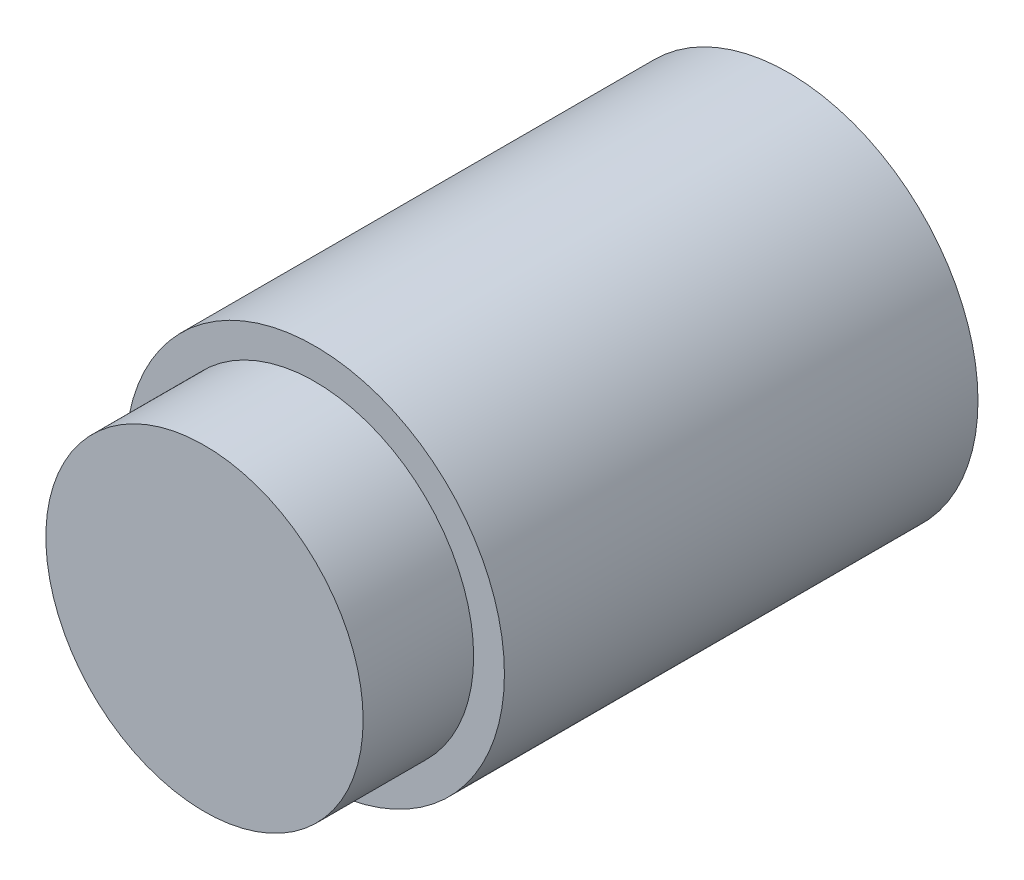
ISO-10303-21;
HEADER;
FILE_DESCRIPTION(('STEP AP214'),'2;1');
FILE_NAME('part.step','',(''),(''),'','','');
FILE_SCHEMA(('AUTOMOTIVE_DESIGN { 1 0 10303 214 1 1 1 1 }'));
ENDSEC;
DATA;
#1=APPLICATION_CONTEXT('core data for automotive mechanical design processes');
#2=APPLICATION_PROTOCOL_DEFINITION('international standard','automotive_design',2000,#1);
#3=PRODUCT_CONTEXT('',#1,'mechanical');
#4=PRODUCT('Part','Part','',(#3));
#5=PRODUCT_RELATED_PRODUCT_CATEGORY('part','',(#4));
#6=PRODUCT_DEFINITION_FORMATION('','',#4);
#7=PRODUCT_DEFINITION_CONTEXT('part definition',#1,'design');
#8=PRODUCT_DEFINITION('design','',#6,#7);
#9=PRODUCT_DEFINITION_SHAPE('','',#8);
#10=(LENGTH_UNIT() NAMED_UNIT(*) SI_UNIT(.MILLI.,.METRE.));
#11=(NAMED_UNIT(*) PLANE_ANGLE_UNIT() SI_UNIT($,.RADIAN.));
#12=(NAMED_UNIT(*) SI_UNIT($,.STERADIAN.) SOLID_ANGLE_UNIT());
#13=UNCERTAINTY_MEASURE_WITH_UNIT(LENGTH_MEASURE(1.E-05),#10,'distance_accuracy_value','');
#14=(GEOMETRIC_REPRESENTATION_CONTEXT(3) GLOBAL_UNCERTAINTY_ASSIGNED_CONTEXT((#13)) GLOBAL_UNIT_ASSIGNED_CONTEXT((#10,
#11,#12)) REPRESENTATION_CONTEXT('',''));
#15=CARTESIAN_POINT('',(0.,0.,0.));
#16=DIRECTION('',(0.,0.,1.));
#17=DIRECTION('',(1.,0.,0.));
#18=AXIS2_PLACEMENT_3D('',#15,#16,#17);
#19=CARTESIAN_POINT('',(0.,0.,15.));
#20=DIRECTION('',(0.,0.,-1.));
#21=DIRECTION('',(-1.,0.,0.));
#22=AXIS2_PLACEMENT_3D('',#19,#20,#21);
#23=CYLINDRICAL_SURFACE('',#22,6.);
#24=CARTESIAN_POINT('',(0.,0.,15.));
#25=DIRECTION('',(0.,0.,1.));
#26=DIRECTION('',(1.,0.,0.));
#27=AXIS2_PLACEMENT_3D('',#24,#25,#26);
#28=CIRCLE('',#27,6.);
#29=CARTESIAN_POINT('',(6.,0.,15.));
#30=VERTEX_POINT('',#29);
#31=EDGE_CURVE('E51',#30,#30,#28,.T.);
#32=ORIENTED_EDGE('',*,*,#31,.F.);
#33=EDGE_LOOP('',(#32));
#34=FACE_BOUND('',#33,.T.);
#35=CARTESIAN_POINT('',(0.,0.,0.));
#36=DIRECTION('',(0.,0.,1.));
#37=DIRECTION('',(1.,0.,0.));
#38=AXIS2_PLACEMENT_3D('',#35,#36,#37);
#39=CIRCLE('',#38,6.);
#40=CARTESIAN_POINT('',(6.,0.,0.));
#41=VERTEX_POINT('',#40);
#42=EDGE_CURVE('E46',#41,#41,#39,.T.);
#43=ORIENTED_EDGE('',*,*,#42,.T.);
#44=EDGE_LOOP('',(#43));
#45=FACE_BOUND('',#44,.T.);
#46=ADVANCED_FACE('F43',(#34,#45),#23,.T.);
#47=CARTESIAN_POINT('',(0.,0.,15.));
#48=DIRECTION('',(0.,0.,1.));
#49=DIRECTION('',(1.,0.,0.));
#50=AXIS2_PLACEMENT_3D('',#47,#48,#49);
#51=PLANE('',#50);
#52=CARTESIAN_POINT('',(0.,0.,15.));
#53=DIRECTION('',(0.,0.,1.));
#54=DIRECTION('',(1.,0.,0.));
#55=AXIS2_PLACEMENT_3D('',#52,#53,#54);
#56=CIRCLE('',#55,5.025);
#57=CARTESIAN_POINT('',(5.025,0.,15.));
#58=VERTEX_POINT('',#57);
#59=EDGE_CURVE('E10',#58,#58,#56,.T.);
#60=ORIENTED_EDGE('',*,*,#59,.F.);
#61=EDGE_LOOP('',(#60));
#62=FACE_BOUND('',#61,.T.);
#63=ORIENTED_EDGE('',*,*,#31,.T.);
#64=EDGE_LOOP('',(#63));
#65=FACE_BOUND('',#64,.T.);
#66=ADVANCED_FACE('F71',(#62,#65),#51,.T.);
#67=CARTESIAN_POINT('',(0.,0.,0.));
#68=DIRECTION('',(0.,0.,1.));
#69=DIRECTION('',(1.,0.,0.));
#70=AXIS2_PLACEMENT_3D('',#67,#68,#69);
#71=PLANE('',#70);
#72=ORIENTED_EDGE('',*,*,#42,.F.);
#73=EDGE_LOOP('',(#72));
#74=FACE_BOUND('',#73,.T.);
#75=ADVANCED_FACE('F68',(#74),#71,.F.);
#76=CARTESIAN_POINT('',(0.,0.,18.5));
#77=DIRECTION('',(0.,0.,-1.));
#78=DIRECTION('',(-1.,0.,0.));
#79=AXIS2_PLACEMENT_3D('',#76,#77,#78);
#80=CYLINDRICAL_SURFACE('',#79,5.025);
#81=CARTESIAN_POINT('',(0.,0.,18.5));
#82=DIRECTION('',(0.,0.,1.));
#83=DIRECTION('',(1.,0.,0.));
#84=AXIS2_PLACEMENT_3D('',#81,#82,#83);
#85=CIRCLE('',#84,5.025);
#86=CARTESIAN_POINT('',(5.025,0.,18.5));
#87=VERTEX_POINT('',#86);
#88=EDGE_CURVE('E58',#87,#87,#85,.T.);
#89=ORIENTED_EDGE('',*,*,#88,.F.);
#90=EDGE_LOOP('',(#89));
#91=FACE_BOUND('',#90,.T.);
#92=ORIENTED_EDGE('',*,*,#59,.T.);
#93=EDGE_LOOP('',(#92));
#94=FACE_BOUND('',#93,.T.);
#95=ADVANCED_FACE('F70',(#91,#94),#80,.T.);
#96=CARTESIAN_POINT('',(0.,0.,18.5));
#97=DIRECTION('',(0.,0.,1.));
#98=DIRECTION('',(1.,0.,0.));
#99=AXIS2_PLACEMENT_3D('',#96,#97,#98);
#100=PLANE('',#99);
#101=ORIENTED_EDGE('',*,*,#88,.T.);
#102=EDGE_LOOP('',(#101));
#103=FACE_BOUND('',#102,.T.);
#104=ADVANCED_FACE('F77',(#103),#100,.T.);
#105=CLOSED_SHELL('',(#46,#66,#75,#95,#104));
#106=MANIFOLD_SOLID_BREP('B2',#105);
#107=ADVANCED_BREP_SHAPE_REPRESENTATION('',(#18,#106),#14);
#108=SHAPE_DEFINITION_REPRESENTATION(#9,#107);
ENDSEC;
END-ISO-10303-21;
